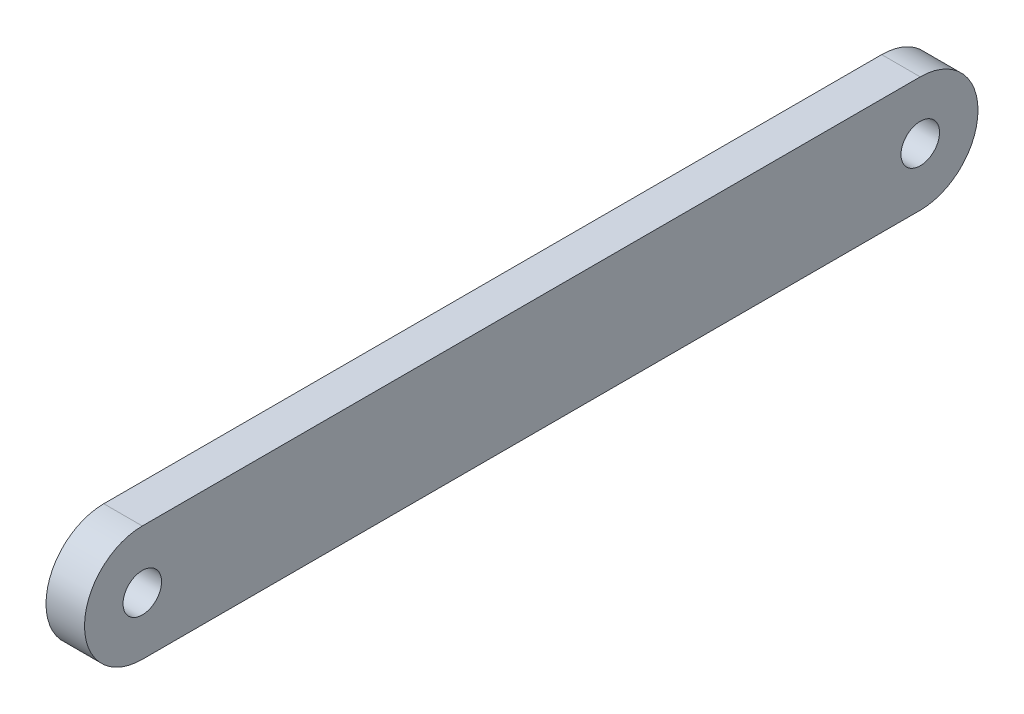
ISO-10303-21;
HEADER;
FILE_DESCRIPTION(('STEP AP214'),'2;1');
FILE_NAME('part.step','',(''),(''),'','','');
FILE_SCHEMA(('AUTOMOTIVE_DESIGN { 1 0 10303 214 1 1 1 1 }'));
ENDSEC;
DATA;
#1=APPLICATION_CONTEXT('core data for automotive mechanical design processes');
#2=APPLICATION_PROTOCOL_DEFINITION('international standard','automotive_design',2000,#1);
#3=PRODUCT_CONTEXT('',#1,'mechanical');
#4=PRODUCT('Part','Part','',(#3));
#5=PRODUCT_RELATED_PRODUCT_CATEGORY('part','',(#4));
#6=PRODUCT_DEFINITION_FORMATION('','',#4);
#7=PRODUCT_DEFINITION_CONTEXT('part definition',#1,'design');
#8=PRODUCT_DEFINITION('design','',#6,#7);
#9=PRODUCT_DEFINITION_SHAPE('','',#8);
#10=(LENGTH_UNIT() NAMED_UNIT(*) SI_UNIT(.MILLI.,.METRE.));
#11=(NAMED_UNIT(*) PLANE_ANGLE_UNIT() SI_UNIT($,.RADIAN.));
#12=(NAMED_UNIT(*) SI_UNIT($,.STERADIAN.) SOLID_ANGLE_UNIT());
#13=UNCERTAINTY_MEASURE_WITH_UNIT(LENGTH_MEASURE(1.E-05),#10,'distance_accuracy_value','');
#14=(GEOMETRIC_REPRESENTATION_CONTEXT(3) GLOBAL_UNCERTAINTY_ASSIGNED_CONTEXT((#13)) GLOBAL_UNIT_ASSIGNED_CONTEXT((#10,
#11,#12)) REPRESENTATION_CONTEXT('',''));
#15=CARTESIAN_POINT('',(0.,0.,0.));
#16=DIRECTION('',(0.,0.,1.));
#17=DIRECTION('',(1.,0.,0.));
#18=AXIS2_PLACEMENT_3D('',#15,#16,#17);
#19=CARTESIAN_POINT('',(4.5,0.,40.));
#20=DIRECTION('',(1.,0.,0.));
#21=DIRECTION('',(0.,0.,-1.));
#22=AXIS2_PLACEMENT_3D('',#19,#20,#21);
#23=PLANE('',#22);
#24=CARTESIAN_POINT('',(4.5,0.,-40.78760592));
#25=DIRECTION('',(-1.,0.,0.));
#26=DIRECTION('',(0.,0.,1.));
#27=AXIS2_PLACEMENT_3D('',#24,#25,#26);
#28=CIRCLE('',#27,2.);
#29=CARTESIAN_POINT('',(4.5,0.,-38.78760592));
#30=VERTEX_POINT('',#29);
#31=EDGE_CURVE('E105',#30,#30,#28,.T.);
#32=ORIENTED_EDGE('',*,*,#31,.T.);
#33=EDGE_LOOP('',(#32));
#34=FACE_BOUND('',#33,.T.);
#35=DIRECTION('',(0.,0.,-1.));
#36=VECTOR('',#35,1.);
#37=CARTESIAN_POINT('',(4.5,-6.,40.));
#38=LINE('',#37,#36);
#39=CARTESIAN_POINT('',(4.5,-6.,40.));
#40=VERTEX_POINT('',#39);
#41=CARTESIAN_POINT('',(4.5,-6.00000000000003,-40.78212409));
#42=VERTEX_POINT('',#41);
#43=EDGE_CURVE('E120',#40,#42,#38,.T.);
#44=ORIENTED_EDGE('',*,*,#43,.T.);
#45=CARTESIAN_POINT('',(4.5,0.,-40.78212409));
#46=DIRECTION('',(-1.,0.,0.));
#47=DIRECTION('',(0.,0.,1.));
#48=AXIS2_PLACEMENT_3D('',#45,#46,#47);
#49=CIRCLE('',#48,6.00000000000002);
#50=CARTESIAN_POINT('',(4.5,6.00000000000002,-40.78212409));
#51=VERTEX_POINT('',#50);
#52=EDGE_CURVE('E104',#51,#42,#49,.T.);
#53=ORIENTED_EDGE('',*,*,#52,.F.);
#54=DIRECTION('',(0.,0.,1.));
#55=VECTOR('',#54,1.);
#56=CARTESIAN_POINT('',(4.5,6.,40.));
#57=LINE('',#56,#55);
#58=CARTESIAN_POINT('',(4.5,6.,40.));
#59=VERTEX_POINT('',#58);
#60=EDGE_CURVE('E60',#51,#59,#57,.T.);
#61=ORIENTED_EDGE('',*,*,#60,.T.);
#62=CARTESIAN_POINT('',(4.5,0.,40.));
#63=DIRECTION('',(1.,0.,0.));
#64=DIRECTION('',(0.,0.,-1.));
#65=AXIS2_PLACEMENT_3D('',#62,#63,#64);
#66=CIRCLE('',#65,6.);
#67=EDGE_CURVE('E92',#59,#40,#66,.T.);
#68=ORIENTED_EDGE('',*,*,#67,.T.);
#69=EDGE_LOOP('',(#44,#53,#61,#68));
#70=FACE_BOUND('',#69,.T.);
#71=CARTESIAN_POINT('',(4.5,0.,40.));
#72=DIRECTION('',(1.,0.,0.));
#73=DIRECTION('',(0.,0.,-1.));
#74=AXIS2_PLACEMENT_3D('',#71,#72,#73);
#75=CIRCLE('',#74,2.);
#76=CARTESIAN_POINT('',(4.5,0.,38.));
#77=VERTEX_POINT('',#76);
#78=EDGE_CURVE('E98',#77,#77,#75,.T.);
#79=ORIENTED_EDGE('',*,*,#78,.F.);
#80=EDGE_LOOP('',(#79));
#81=FACE_BOUND('',#80,.T.);
#82=ADVANCED_FACE('F43',(#34,#70,#81),#23,.T.);
#83=CARTESIAN_POINT('',(0.5,0.,40.));
#84=DIRECTION('',(1.,0.,0.));
#85=DIRECTION('',(0.,0.,-1.));
#86=AXIS2_PLACEMENT_3D('',#83,#84,#85);
#87=PLANE('',#86);
#88=CARTESIAN_POINT('',(0.5,0.,-40.78760592));
#89=DIRECTION('',(-1.,0.,0.));
#90=DIRECTION('',(0.,0.,1.));
#91=AXIS2_PLACEMENT_3D('',#88,#89,#90);
#92=CIRCLE('',#91,2.);
#93=CARTESIAN_POINT('',(0.5,0.,-38.78760592));
#94=VERTEX_POINT('',#93);
#95=EDGE_CURVE('E109',#94,#94,#92,.T.);
#96=ORIENTED_EDGE('',*,*,#95,.F.);
#97=EDGE_LOOP('',(#96));
#98=FACE_BOUND('',#97,.T.);
#99=CARTESIAN_POINT('',(0.5,0.,40.));
#100=DIRECTION('',(1.,0.,0.));
#101=DIRECTION('',(0.,0.,-1.));
#102=AXIS2_PLACEMENT_3D('',#99,#100,#101);
#103=CIRCLE('',#102,2.);
#104=CARTESIAN_POINT('',(0.5,0.,38.));
#105=VERTEX_POINT('',#104);
#106=EDGE_CURVE('E114',#105,#105,#103,.T.);
#107=ORIENTED_EDGE('',*,*,#106,.T.);
#108=EDGE_LOOP('',(#107));
#109=FACE_BOUND('',#108,.T.);
#110=CARTESIAN_POINT('',(0.5,0.,40.));
#111=DIRECTION('',(1.,0.,0.));
#112=DIRECTION('',(0.,0.,-1.));
#113=AXIS2_PLACEMENT_3D('',#110,#111,#112);
#114=CIRCLE('',#113,6.);
#115=CARTESIAN_POINT('',(0.5,6.,40.));
#116=VERTEX_POINT('',#115);
#117=CARTESIAN_POINT('',(0.5,-6.,40.));
#118=VERTEX_POINT('',#117);
#119=EDGE_CURVE('E90',#116,#118,#114,.T.);
#120=ORIENTED_EDGE('',*,*,#119,.F.);
#121=DIRECTION('',(0.,0.,1.));
#122=VECTOR('',#121,1.);
#123=CARTESIAN_POINT('',(0.5,6.,40.));
#124=LINE('',#123,#122);
#125=CARTESIAN_POINT('',(0.5,6.00000000000002,-40.78212409));
#126=VERTEX_POINT('',#125);
#127=EDGE_CURVE('E85',#126,#116,#124,.T.);
#128=ORIENTED_EDGE('',*,*,#127,.F.);
#129=CARTESIAN_POINT('',(0.5,0.,-40.78212409));
#130=DIRECTION('',(-1.,0.,0.));
#131=DIRECTION('',(0.,0.,1.));
#132=AXIS2_PLACEMENT_3D('',#129,#130,#131);
#133=CIRCLE('',#132,6.00000000000002);
#134=CARTESIAN_POINT('',(0.5,-6.00000000000003,-40.78212409));
#135=VERTEX_POINT('',#134);
#136=EDGE_CURVE('E88',#126,#135,#133,.T.);
#137=ORIENTED_EDGE('',*,*,#136,.T.);
#138=DIRECTION('',(0.,0.,-1.));
#139=VECTOR('',#138,1.);
#140=CARTESIAN_POINT('',(0.5,-6.,40.));
#141=LINE('',#140,#139);
#142=EDGE_CURVE('E72',#118,#135,#141,.T.);
#143=ORIENTED_EDGE('',*,*,#142,.F.);
#144=EDGE_LOOP('',(#120,#128,#137,#143));
#145=FACE_BOUND('',#144,.T.);
#146=ADVANCED_FACE('F86',(#98,#109,#145),#87,.F.);
#147=CARTESIAN_POINT('',(4.5,0.,40.));
#148=DIRECTION('',(-1.,0.,0.));
#149=DIRECTION('',(0.,0.,1.));
#150=AXIS2_PLACEMENT_3D('',#147,#148,#149);
#151=CYLINDRICAL_SURFACE('',#150,6.);
#152=ORIENTED_EDGE('',*,*,#119,.T.);
#153=DIRECTION('',(-1.,0.,0.));
#154=VECTOR('',#153,1.);
#155=CARTESIAN_POINT('',(4.5,-6.,40.));
#156=LINE('',#155,#154);
#157=EDGE_CURVE('E11',#40,#118,#156,.T.);
#158=ORIENTED_EDGE('',*,*,#157,.F.);
#159=ORIENTED_EDGE('',*,*,#67,.F.);
#160=DIRECTION('',(-1.,0.,0.));
#161=VECTOR('',#160,1.);
#162=CARTESIAN_POINT('',(4.5,6.,40.));
#163=LINE('',#162,#161);
#164=EDGE_CURVE('E52',#59,#116,#163,.T.);
#165=ORIENTED_EDGE('',*,*,#164,.T.);
#166=EDGE_LOOP('',(#152,#158,#159,#165));
#167=FACE_BOUND('',#166,.T.);
#168=ADVANCED_FACE('F45',(#167),#151,.T.);
#169=CARTESIAN_POINT('',(4.5,-6.,40.));
#170=DIRECTION('',(0.,1.,0.));
#171=DIRECTION('',(0.,0.,1.));
#172=AXIS2_PLACEMENT_3D('',#169,#170,#171);
#173=PLANE('',#172);
#174=ORIENTED_EDGE('',*,*,#142,.T.);
#175=DIRECTION('',(-1.,0.,0.));
#176=VECTOR('',#175,1.);
#177=CARTESIAN_POINT('',(4.5,-6.00000000000003,-40.78212409));
#178=LINE('',#177,#176);
#179=EDGE_CURVE('E99',#42,#135,#178,.T.);
#180=ORIENTED_EDGE('',*,*,#179,.F.);
#181=ORIENTED_EDGE('',*,*,#43,.F.);
#182=ORIENTED_EDGE('',*,*,#157,.T.);
#183=EDGE_LOOP('',(#174,#180,#181,#182));
#184=FACE_BOUND('',#183,.T.);
#185=ADVANCED_FACE('F129',(#184),#173,.F.);
#186=CARTESIAN_POINT('',(4.5,6.,40.));
#187=DIRECTION('',(0.,-1.,0.));
#188=DIRECTION('',(0.,0.,-1.));
#189=AXIS2_PLACEMENT_3D('',#186,#187,#188);
#190=PLANE('',#189);
#191=ORIENTED_EDGE('',*,*,#164,.F.);
#192=ORIENTED_EDGE('',*,*,#60,.F.);
#193=DIRECTION('',(-1.,0.,0.));
#194=VECTOR('',#193,1.);
#195=CARTESIAN_POINT('',(4.5,6.00000000000002,-40.78212409));
#196=LINE('',#195,#194);
#197=EDGE_CURVE('E94',#51,#126,#196,.T.);
#198=ORIENTED_EDGE('',*,*,#197,.T.);
#199=ORIENTED_EDGE('',*,*,#127,.T.);
#200=EDGE_LOOP('',(#191,#192,#198,#199));
#201=FACE_BOUND('',#200,.T.);
#202=ADVANCED_FACE('F95',(#201),#190,.F.);
#203=CARTESIAN_POINT('',(0.5,0.,40.));
#204=DIRECTION('',(1.,0.,0.));
#205=DIRECTION('',(0.,0.,-1.));
#206=AXIS2_PLACEMENT_3D('',#203,#204,#205);
#207=CYLINDRICAL_SURFACE('',#206,2.);
#208=ORIENTED_EDGE('',*,*,#106,.F.);
#209=EDGE_LOOP('',(#208));
#210=FACE_BOUND('',#209,.T.);
#211=ORIENTED_EDGE('',*,*,#78,.T.);
#212=EDGE_LOOP('',(#211));
#213=FACE_BOUND('',#212,.T.);
#214=ADVANCED_FACE('F135',(#210,#213),#207,.F.);
#215=CARTESIAN_POINT('',(4.5,0.,-40.78212409));
#216=DIRECTION('',(-1.,0.,0.));
#217=DIRECTION('',(0.,0.,1.));
#218=AXIS2_PLACEMENT_3D('',#215,#216,#217);
#219=CYLINDRICAL_SURFACE('',#218,6.00000000000002);
#220=ORIENTED_EDGE('',*,*,#136,.F.);
#221=ORIENTED_EDGE('',*,*,#197,.F.);
#222=ORIENTED_EDGE('',*,*,#52,.T.);
#223=ORIENTED_EDGE('',*,*,#179,.T.);
#224=EDGE_LOOP('',(#220,#221,#222,#223));
#225=FACE_BOUND('',#224,.T.);
#226=ADVANCED_FACE('F102',(#225),#219,.T.);
#227=CARTESIAN_POINT('',(4.5,0.,-40.78760592));
#228=DIRECTION('',(-1.,0.,0.));
#229=DIRECTION('',(0.,0.,1.));
#230=AXIS2_PLACEMENT_3D('',#227,#228,#229);
#231=CYLINDRICAL_SURFACE('',#230,2.);
#232=ORIENTED_EDGE('',*,*,#31,.F.);
#233=EDGE_LOOP('',(#232));
#234=FACE_BOUND('',#233,.T.);
#235=ORIENTED_EDGE('',*,*,#95,.T.);
#236=EDGE_LOOP('',(#235));
#237=FACE_BOUND('',#236,.T.);
#238=ADVANCED_FACE('F152',(#234,#237),#231,.F.);
#239=CLOSED_SHELL('',(#82,#146,#168,#185,#202,#214,#226,#238));
#240=MANIFOLD_SOLID_BREP('B2',#239);
#241=ADVANCED_BREP_SHAPE_REPRESENTATION('',(#18,#240),#14);
#242=SHAPE_DEFINITION_REPRESENTATION(#9,#241);
ENDSEC;
END-ISO-10303-21;
